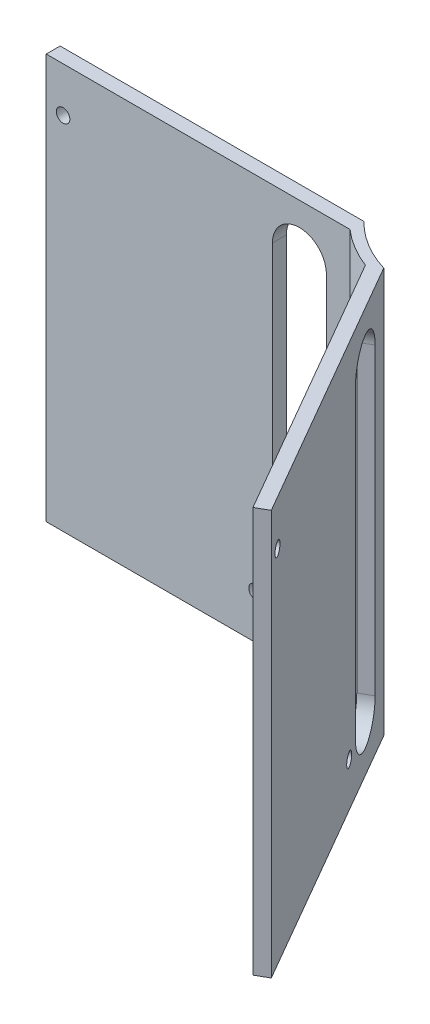
ISO-10303-21;
HEADER;
FILE_DESCRIPTION(('STEP AP214'),'2;1');
FILE_NAME('part.step','',(''),(''),'','','');
FILE_SCHEMA(('AUTOMOTIVE_DESIGN { 1 0 10303 214 1 1 1 1 }'));
ENDSEC;
DATA;
#1=APPLICATION_CONTEXT('core data for automotive mechanical design processes');
#2=APPLICATION_PROTOCOL_DEFINITION('international standard','automotive_design',2000,#1);
#3=PRODUCT_CONTEXT('',#1,'mechanical');
#4=PRODUCT('Part','Part','',(#3));
#5=PRODUCT_RELATED_PRODUCT_CATEGORY('part','',(#4));
#6=PRODUCT_DEFINITION_FORMATION('','',#4);
#7=PRODUCT_DEFINITION_CONTEXT('part definition',#1,'design');
#8=PRODUCT_DEFINITION('design','',#6,#7);
#9=PRODUCT_DEFINITION_SHAPE('','',#8);
#10=(LENGTH_UNIT() NAMED_UNIT(*) SI_UNIT(.MILLI.,.METRE.));
#11=(NAMED_UNIT(*) PLANE_ANGLE_UNIT() SI_UNIT($,.RADIAN.));
#12=(NAMED_UNIT(*) SI_UNIT($,.STERADIAN.) SOLID_ANGLE_UNIT());
#13=UNCERTAINTY_MEASURE_WITH_UNIT(LENGTH_MEASURE(1.E-05),#10,'distance_accuracy_value','');
#14=(GEOMETRIC_REPRESENTATION_CONTEXT(3) GLOBAL_UNCERTAINTY_ASSIGNED_CONTEXT((#13)) GLOBAL_UNIT_ASSIGNED_CONTEXT((#10,
#11,#12)) REPRESENTATION_CONTEXT('',''));
#15=CARTESIAN_POINT('',(0.,0.,0.));
#16=DIRECTION('',(0.,0.,1.));
#17=DIRECTION('',(1.,0.,0.));
#18=AXIS2_PLACEMENT_3D('',#15,#16,#17);
#19=CARTESIAN_POINT('',(0.,120.,28.6181760425084));
#20=DIRECTION('',(0.,0.,1.));
#21=DIRECTION('',(1.,0.,0.));
#22=AXIS2_PLACEMENT_3D('',#19,#20,#21);
#23=PLANE('',#22);
#24=CARTESIAN_POINT('',(-52.9999999999999,13.,28.6181760425084));
#25=DIRECTION('',(0.,0.,1.));
#26=DIRECTION('',(1.,0.,0.));
#27=AXIS2_PLACEMENT_3D('',#24,#25,#26);
#28=CIRCLE('',#27,2.);
#29=CARTESIAN_POINT('',(-50.9999999999999,13.,28.6181760425084));
#30=VERTEX_POINT('',#29);
#31=EDGE_CURVE('E291',#30,#30,#28,.T.);
#32=ORIENTED_EDGE('',*,*,#31,.F.);
#33=EDGE_LOOP('',(#32));
#34=FACE_BOUND('',#33,.T.);
#35=CARTESIAN_POINT('',(-110.,106.75,28.6181760425084));
#36=DIRECTION('',(0.,0.,1.));
#37=DIRECTION('',(1.,0.,0.));
#38=AXIS2_PLACEMENT_3D('',#35,#36,#37);
#39=CIRCLE('',#38,2.);
#40=CARTESIAN_POINT('',(-108.,106.75,28.6181760425084));
#41=VERTEX_POINT('',#40);
#42=EDGE_CURVE('E278',#41,#41,#39,.T.);
#43=ORIENTED_EDGE('',*,*,#42,.F.);
#44=EDGE_LOOP('',(#43));
#45=FACE_BOUND('',#44,.T.);
#46=CARTESIAN_POINT('',(-40.,105.,28.6181760425084));
#47=DIRECTION('',(0.,0.,1.));
#48=DIRECTION('',(-1.,0.,0.));
#49=AXIS2_PLACEMENT_3D('',#46,#47,#48);
#50=CIRCLE('',#49,8.);
#51=CARTESIAN_POINT('',(-32.,105.,28.6181760425084));
#52=VERTEX_POINT('',#51);
#53=CARTESIAN_POINT('',(-48.,105.,28.6181760425084));
#54=VERTEX_POINT('',#53);
#55=EDGE_CURVE('E179',#52,#54,#50,.T.);
#56=ORIENTED_EDGE('',*,*,#55,.F.);
#57=DIRECTION('',(0.,1.,0.));
#58=VECTOR('',#57,1.);
#59=CARTESIAN_POINT('',(-32.,105.,28.6181760425084));
#60=LINE('',#59,#58);
#61=CARTESIAN_POINT('',(-32.,15.,28.6181760425084));
#62=VERTEX_POINT('',#61);
#63=EDGE_CURVE('E186',#62,#52,#60,.T.);
#64=ORIENTED_EDGE('',*,*,#63,.F.);
#65=CARTESIAN_POINT('',(-40.,15.,28.6181760425084));
#66=DIRECTION('',(0.,0.,1.));
#67=DIRECTION('',(1.,0.,0.));
#68=AXIS2_PLACEMENT_3D('',#65,#66,#67);
#69=CIRCLE('',#68,8.00000000000001);
#70=CARTESIAN_POINT('',(-48.,15.,28.6181760425084));
#71=VERTEX_POINT('',#70);
#72=EDGE_CURVE('E200',#71,#62,#69,.T.);
#73=ORIENTED_EDGE('',*,*,#72,.F.);
#74=DIRECTION('',(0.,-1.,0.));
#75=VECTOR('',#74,1.);
#76=CARTESIAN_POINT('',(-48.,105.,28.6181760425084));
#77=LINE('',#76,#75);
#78=EDGE_CURVE('E197',#54,#71,#77,.T.);
#79=ORIENTED_EDGE('',*,*,#78,.F.);
#80=EDGE_LOOP('',(#56,#64,#73,#79));
#81=FACE_BOUND('',#80,.T.);
#82=DIRECTION('',(-1.,0.,0.));
#83=VECTOR('',#82,1.);
#84=CARTESIAN_POINT('',(0.,0.,28.6181760425084));
#85=LINE('',#84,#83);
#86=CARTESIAN_POINT('',(-25.,0.,28.6181760425084));
#87=VERTEX_POINT('',#86);
#88=CARTESIAN_POINT('',(-115.,0.,28.6181760425084));
#89=VERTEX_POINT('',#88);
#90=EDGE_CURVE('E207',#87,#89,#85,.T.);
#91=ORIENTED_EDGE('',*,*,#90,.F.);
#92=DIRECTION('',(0.,-1.,0.));
#93=VECTOR('',#92,1.);
#94=CARTESIAN_POINT('',(-25.,120.,28.6181760425084));
#95=LINE('',#94,#93);
#96=CARTESIAN_POINT('',(-25.,120.,28.6181760425084));
#97=VERTEX_POINT('',#96);
#98=EDGE_CURVE('E271',#97,#87,#95,.T.);
#99=ORIENTED_EDGE('',*,*,#98,.F.);
#100=DIRECTION('',(-1.,0.,0.));
#101=VECTOR('',#100,1.);
#102=CARTESIAN_POINT('',(0.,120.,28.6181760425084));
#103=LINE('',#102,#101);
#104=CARTESIAN_POINT('',(-115.,120.,28.6181760425084));
#105=VERTEX_POINT('',#104);
#106=EDGE_CURVE('E214',#97,#105,#103,.T.);
#107=ORIENTED_EDGE('',*,*,#106,.T.);
#108=DIRECTION('',(0.,-1.,0.));
#109=VECTOR('',#108,1.);
#110=CARTESIAN_POINT('',(-115.,120.,28.6181760425084));
#111=LINE('',#110,#109);
#112=EDGE_CURVE('E235',#105,#89,#111,.T.);
#113=ORIENTED_EDGE('',*,*,#112,.T.);
#114=EDGE_LOOP('',(#91,#99,#107,#113));
#115=FACE_BOUND('',#114,.T.);
#116=ADVANCED_FACE('F40',(#34,#45,#81,#115),#23,.T.);
#117=CARTESIAN_POINT('',(0.,120.,0.));
#118=DIRECTION('',(0.,-1.,0.));
#119=DIRECTION('',(0.,0.,-1.));
#120=AXIS2_PLACEMENT_3D('',#117,#118,#119);
#121=CYLINDRICAL_SURFACE('',#120,38.);
#122=CARTESIAN_POINT('',(0.,0.,0.));
#123=DIRECTION('',(0.,1.,0.));
#124=DIRECTION('',(0.,0.,1.));
#125=AXIS2_PLACEMENT_3D('',#122,#123,#124);
#126=CIRCLE('',#125,38.);
#127=CARTESIAN_POINT('',(-13.5526310368752,0.,35.5010731102361));
#128=VERTEX_POINT('',#127);
#129=EDGE_CURVE('E238',#87,#128,#126,.T.);
#130=ORIENTED_EDGE('',*,*,#129,.T.);
#131=DIRECTION('',(0.,-1.,0.));
#132=VECTOR('',#131,1.);
#133=CARTESIAN_POINT('',(-13.5526310368752,120.,35.5010731102361));
#134=LINE('',#133,#132);
#135=CARTESIAN_POINT('',(-13.5526310368752,120.,35.5010731102361));
#136=VERTEX_POINT('',#135);
#137=EDGE_CURVE('E268',#136,#128,#134,.T.);
#138=ORIENTED_EDGE('',*,*,#137,.F.);
#139=CARTESIAN_POINT('',(0.,120.,0.));
#140=DIRECTION('',(0.,1.,0.));
#141=DIRECTION('',(0.,0.,1.));
#142=AXIS2_PLACEMENT_3D('',#139,#140,#141);
#143=CIRCLE('',#142,38.);
#144=EDGE_CURVE('E217',#97,#136,#143,.T.);
#145=ORIENTED_EDGE('',*,*,#144,.F.);
#146=ORIENTED_EDGE('',*,*,#98,.T.);
#147=EDGE_LOOP('',(#130,#138,#145,#146));
#148=FACE_BOUND('',#147,.T.);
#149=ADVANCED_FACE('F310',(#148),#121,.T.);
#150=CARTESIAN_POINT('',(-25.5368888651929,120.,14.7437296605847));
#151=DIRECTION('',(0.866025403784439,0.,-0.5));
#152=DIRECTION('',(-0.5,0.,-0.866025403784439));
#153=AXIS2_PLACEMENT_3D('',#150,#151,#152);
#154=PLANE('',#153);
#155=CARTESIAN_POINT('',(0.447368963124851,13.,59.7497844162004));
#156=DIRECTION('',(-0.866025403784439,0.,0.5));
#157=DIRECTION('',(0.5,0.,0.866025403784439));
#158=AXIS2_PLACEMENT_3D('',#155,#156,#157);
#159=CIRCLE('',#158,2.);
#160=CARTESIAN_POINT('',(1.44736896312485,13.,61.4818352237693));
#161=VERTEX_POINT('',#160);
#162=EDGE_CURVE('E548',#161,#161,#159,.T.);
#163=ORIENTED_EDGE('',*,*,#162,.F.);
#164=EDGE_LOOP('',(#163));
#165=FACE_BOUND('',#164,.T.);
#166=CARTESIAN_POINT('',(29.4631111348071,106.75,110.006524076873));
#167=DIRECTION('',(-0.866025403784439,0.,0.5));
#168=DIRECTION('',(0.5,0.,0.866025403784439));
#169=AXIS2_PLACEMENT_3D('',#166,#167,#168);
#170=CIRCLE('',#169,2.);
#171=CARTESIAN_POINT('',(30.4631111348071,106.75,111.738574884442));
#172=VERTEX_POINT('',#171);
#173=EDGE_CURVE('E279',#172,#172,#170,.T.);
#174=ORIENTED_EDGE('',*,*,#173,.F.);
#175=EDGE_LOOP('',(#174));
#176=FACE_BOUND('',#175,.T.);
#177=DIRECTION('',(0.,-1.,0.));
#178=VECTOR('',#177,1.);
#179=CARTESIAN_POINT('',(-10.0526310368752,105.,41.5632509367272));
#180=LINE('',#179,#178);
#181=CARTESIAN_POINT('',(-10.0526310368752,105.,41.5632509367272));
#182=VERTEX_POINT('',#181);
#183=CARTESIAN_POINT('',(-10.0526310368752,15.,41.5632509367272));
#184=VERTEX_POINT('',#183);
#185=EDGE_CURVE('E165',#182,#184,#180,.T.);
#186=ORIENTED_EDGE('',*,*,#185,.F.);
#187=CARTESIAN_POINT('',(-6.05263103687518,105.,48.4914541670027));
#188=DIRECTION('',(-0.866025403784439,0.,0.5));
#189=DIRECTION('',(0.5,0.,0.866025403784439));
#190=AXIS2_PLACEMENT_3D('',#187,#188,#189);
#191=CIRCLE('',#190,8.);
#192=CARTESIAN_POINT('',(-2.05263103687518,105.,55.4196573972782));
#193=VERTEX_POINT('',#192);
#194=EDGE_CURVE('E56',#193,#182,#191,.T.);
#195=ORIENTED_EDGE('',*,*,#194,.F.);
#196=DIRECTION('',(0.,1.,0.));
#197=VECTOR('',#196,1.);
#198=CARTESIAN_POINT('',(-2.05263103687518,105.,55.4196573972782));
#199=LINE('',#198,#197);
#200=CARTESIAN_POINT('',(-2.05263103687518,15.,55.4196573972782));
#201=VERTEX_POINT('',#200);
#202=EDGE_CURVE('E172',#201,#193,#199,.T.);
#203=ORIENTED_EDGE('',*,*,#202,.F.);
#204=CARTESIAN_POINT('',(-6.05263103687518,15.,48.4914541670027));
#205=DIRECTION('',(-0.866025403784439,0.,0.5));
#206=DIRECTION('',(-0.5,0.,-0.866025403784439));
#207=AXIS2_PLACEMENT_3D('',#204,#205,#206);
#208=CIRCLE('',#207,8.);
#209=EDGE_CURVE('E156',#184,#201,#208,.T.);
#210=ORIENTED_EDGE('',*,*,#209,.F.);
#211=EDGE_LOOP('',(#186,#195,#203,#210));
#212=FACE_BOUND('',#211,.T.);
#213=DIRECTION('',(0.5,0.,0.866025403784439));
#214=VECTOR('',#213,1.);
#215=CARTESIAN_POINT('',(-25.5368888651929,0.,14.7437296605847));
#216=LINE('',#215,#214);
#217=CARTESIAN_POINT('',(31.9631111348071,0.,114.336651095795));
#218=VERTEX_POINT('',#217);
#219=EDGE_CURVE('E240',#128,#218,#216,.T.);
#220=ORIENTED_EDGE('',*,*,#219,.T.);
#221=DIRECTION('',(0.,-1.,0.));
#222=VECTOR('',#221,1.);
#223=CARTESIAN_POINT('',(31.9631111348071,120.,114.336651095795));
#224=LINE('',#223,#222);
#225=CARTESIAN_POINT('',(31.9631111348071,120.,114.336651095795));
#226=VERTEX_POINT('',#225);
#227=EDGE_CURVE('E265',#226,#218,#224,.T.);
#228=ORIENTED_EDGE('',*,*,#227,.F.);
#229=DIRECTION('',(0.5,0.,0.866025403784439));
#230=VECTOR('',#229,1.);
#231=CARTESIAN_POINT('',(-25.5368888651929,120.,14.7437296605847));
#232=LINE('',#231,#230);
#233=EDGE_CURVE('E220',#136,#226,#232,.T.);
#234=ORIENTED_EDGE('',*,*,#233,.F.);
#235=ORIENTED_EDGE('',*,*,#137,.T.);
#236=EDGE_LOOP('',(#220,#228,#234,#235));
#237=FACE_BOUND('',#236,.T.);
#238=ADVANCED_FACE('F169',(#165,#176,#212,#237),#154,.F.);
#239=CARTESIAN_POINT('',(57.5000000000002,120.,99.5929214352103));
#240=DIRECTION('',(-0.500000000000002,0.,-0.866025403784438));
#241=DIRECTION('',(-0.866025403784438,0.,0.500000000000002));
#242=AXIS2_PLACEMENT_3D('',#239,#240,#241);
#243=PLANE('',#242);
#244=DIRECTION('',(0.866025403784438,0.,-0.500000000000002));
#245=VECTOR('',#244,1.);
#246=CARTESIAN_POINT('',(57.5000000000002,0.,99.5929214352103));
#247=LINE('',#246,#245);
#248=CARTESIAN_POINT('',(35.411933246361,0.,112.345472721302));
#249=VERTEX_POINT('',#248);
#250=EDGE_CURVE('E242',#218,#249,#247,.T.);
#251=ORIENTED_EDGE('',*,*,#250,.T.);
#252=DIRECTION('',(0.,-1.,0.));
#253=VECTOR('',#252,1.);
#254=CARTESIAN_POINT('',(35.411933246361,120.,112.345472721302));
#255=LINE('',#254,#253);
#256=CARTESIAN_POINT('',(35.411933246361,120.,112.345472721302));
#257=VERTEX_POINT('',#256);
#258=EDGE_CURVE('E263',#257,#249,#255,.T.);
#259=ORIENTED_EDGE('',*,*,#258,.F.);
#260=DIRECTION('',(0.866025403784438,0.,-0.500000000000002));
#261=VECTOR('',#260,1.);
#262=CARTESIAN_POINT('',(57.5000000000002,120.,99.5929214352103));
#263=LINE('',#262,#261);
#264=EDGE_CURVE('E222',#226,#257,#263,.T.);
#265=ORIENTED_EDGE('',*,*,#264,.F.);
#266=ORIENTED_EDGE('',*,*,#227,.T.);
#267=EDGE_LOOP('',(#251,#259,#265,#266));
#268=FACE_BOUND('',#267,.T.);
#269=ADVANCED_FACE('F341',(#268),#243,.F.);
#270=CARTESIAN_POINT('',(-22.0880667536391,120.,12.752551286092));
#271=DIRECTION('',(0.866025403784438,0.,-0.5));
#272=DIRECTION('',(-0.5,0.,-0.866025403784438));
#273=AXIS2_PLACEMENT_3D('',#270,#271,#272);
#274=PLANE('',#273);
#275=CARTESIAN_POINT('',(3.89619107467873,13.,57.7586060417077));
#276=DIRECTION('',(0.866025403784438,0.,-0.5));
#277=DIRECTION('',(-0.5,0.,-0.866025403784438));
#278=AXIS2_PLACEMENT_3D('',#275,#276,#277);
#279=CIRCLE('',#278,2.);
#280=CARTESIAN_POINT('',(2.89619107467873,13.,56.0265552341388));
#281=VERTEX_POINT('',#280);
#282=EDGE_CURVE('E43',#281,#281,#279,.T.);
#283=ORIENTED_EDGE('',*,*,#282,.F.);
#284=EDGE_LOOP('',(#283));
#285=FACE_BOUND('',#284,.T.);
#286=CARTESIAN_POINT('',(32.911933246361,106.75,108.01534570238));
#287=DIRECTION('',(0.866025403784438,0.,-0.5));
#288=DIRECTION('',(-0.5,0.,-0.866025403784438));
#289=AXIS2_PLACEMENT_3D('',#286,#287,#288);
#290=CIRCLE('',#289,2.);
#291=CARTESIAN_POINT('',(31.911933246361,106.75,106.283294894811));
#292=VERTEX_POINT('',#291);
#293=EDGE_CURVE('E276',#292,#292,#290,.T.);
#294=ORIENTED_EDGE('',*,*,#293,.F.);
#295=EDGE_LOOP('',(#294));
#296=FACE_BOUND('',#295,.T.);
#297=CARTESIAN_POINT('',(-2.60380892532131,105.,46.5002757925099));
#298=DIRECTION('',(0.866025403784438,0.,-0.5));
#299=DIRECTION('',(-0.5,0.,-0.866025403784438));
#300=AXIS2_PLACEMENT_3D('',#297,#298,#299);
#301=CIRCLE('',#300,8.);
#302=CARTESIAN_POINT('',(-6.60380892532132,105.,39.5720725622344));
#303=VERTEX_POINT('',#302);
#304=CARTESIAN_POINT('',(1.39619107467868,105.,53.4284790227854));
#305=VERTEX_POINT('',#304);
#306=EDGE_CURVE('E11',#303,#305,#301,.T.);
#307=ORIENTED_EDGE('',*,*,#306,.F.);
#308=DIRECTION('',(0.,1.,0.));
#309=VECTOR('',#308,1.);
#310=CARTESIAN_POINT('',(-6.60380892532132,120.,39.5720725622344));
#311=LINE('',#310,#309);
#312=CARTESIAN_POINT('',(-6.60380892532131,15.,39.5720725622344));
#313=VERTEX_POINT('',#312);
#314=EDGE_CURVE('E273',#313,#303,#311,.T.);
#315=ORIENTED_EDGE('',*,*,#314,.F.);
#316=CARTESIAN_POINT('',(-2.60380892532131,15.,46.5002757925099));
#317=DIRECTION('',(0.866025403784438,0.,-0.5));
#318=DIRECTION('',(-0.5,0.,-0.866025403784438));
#319=AXIS2_PLACEMENT_3D('',#316,#317,#318);
#320=CIRCLE('',#319,8.);
#321=CARTESIAN_POINT('',(1.39619107467869,15.,53.4284790227854));
#322=VERTEX_POINT('',#321);
#323=EDGE_CURVE('E159',#322,#313,#320,.T.);
#324=ORIENTED_EDGE('',*,*,#323,.F.);
#325=DIRECTION('',(0.,-1.,0.));
#326=VECTOR('',#325,1.);
#327=CARTESIAN_POINT('',(1.39619107467869,120.,53.4284790227854));
#328=LINE('',#327,#326);
#329=EDGE_CURVE('E48',#305,#322,#328,.T.);
#330=ORIENTED_EDGE('',*,*,#329,.F.);
#331=EDGE_LOOP('',(#307,#315,#324,#330));
#332=FACE_BOUND('',#331,.T.);
#333=DIRECTION('',(0.5,0.,0.866025403784438));
#334=VECTOR('',#333,1.);
#335=CARTESIAN_POINT('',(-22.0880667536391,0.,12.752551286092));
#336=LINE('',#335,#334);
#337=CARTESIAN_POINT('',(-10.1038089253213,0.,33.5098947357433));
#338=VERTEX_POINT('',#337);
#339=EDGE_CURVE('E245',#338,#249,#336,.T.);
#340=ORIENTED_EDGE('',*,*,#339,.F.);
#341=DIRECTION('',(0.,-1.,0.));
#342=VECTOR('',#341,1.);
#343=CARTESIAN_POINT('',(-10.1038089253213,120.,33.5098947357433));
#344=LINE('',#343,#342);
#345=CARTESIAN_POINT('',(-10.1038089253213,120.,33.5098947357433));
#346=VERTEX_POINT('',#345);
#347=EDGE_CURVE('E261',#346,#338,#344,.T.);
#348=ORIENTED_EDGE('',*,*,#347,.F.);
#349=DIRECTION('',(0.5,0.,0.866025403784438));
#350=VECTOR('',#349,1.);
#351=CARTESIAN_POINT('',(-22.0880667536391,120.,12.752551286092));
#352=LINE('',#351,#350);
#353=EDGE_CURVE('E224',#346,#257,#352,.T.);
#354=ORIENTED_EDGE('',*,*,#353,.T.);
#355=ORIENTED_EDGE('',*,*,#258,.T.);
#356=EDGE_LOOP('',(#340,#348,#354,#355));
#357=FACE_BOUND('',#356,.T.);
#358=ADVANCED_FACE('F337',(#285,#296,#332,#357),#274,.T.);
#359=CARTESIAN_POINT('',(0.,120.,0.));
#360=DIRECTION('',(0.,-1.,0.));
#361=DIRECTION('',(0.,0.,-1.));
#362=AXIS2_PLACEMENT_3D('',#359,#360,#361);
#363=CYLINDRICAL_SURFACE('',#362,35.);
#364=CARTESIAN_POINT('',(0.,0.,0.));
#365=DIRECTION('',(0.,1.,0.));
#366=DIRECTION('',(0.,0.,1.));
#367=AXIS2_PLACEMENT_3D('',#364,#365,#366);
#368=CIRCLE('',#367,35.);
#369=CARTESIAN_POINT('',(-25.,0.,24.4948974278318));
#370=VERTEX_POINT('',#369);
#371=EDGE_CURVE('E248',#370,#338,#368,.T.);
#372=ORIENTED_EDGE('',*,*,#371,.F.);
#373=DIRECTION('',(0.,-1.,0.));
#374=VECTOR('',#373,1.);
#375=CARTESIAN_POINT('',(-25.,120.,24.4948974278318));
#376=LINE('',#375,#374);
#377=CARTESIAN_POINT('',(-25.,120.,24.4948974278318));
#378=VERTEX_POINT('',#377);
#379=EDGE_CURVE('E259',#378,#370,#376,.T.);
#380=ORIENTED_EDGE('',*,*,#379,.F.);
#381=CARTESIAN_POINT('',(0.,120.,0.));
#382=DIRECTION('',(0.,1.,0.));
#383=DIRECTION('',(0.,0.,1.));
#384=AXIS2_PLACEMENT_3D('',#381,#382,#383);
#385=CIRCLE('',#384,35.);
#386=EDGE_CURVE('E227',#378,#346,#385,.T.);
#387=ORIENTED_EDGE('',*,*,#386,.T.);
#388=ORIENTED_EDGE('',*,*,#347,.T.);
#389=EDGE_LOOP('',(#372,#380,#387,#388));
#390=FACE_BOUND('',#389,.T.);
#391=ADVANCED_FACE('F332',(#390),#363,.F.);
#392=CARTESIAN_POINT('',(0.,120.,24.4948974278318));
#393=DIRECTION('',(0.,0.,1.));
#394=DIRECTION('',(1.,0.,0.));
#395=AXIS2_PLACEMENT_3D('',#392,#393,#394);
#396=PLANE('',#395);
#397=CARTESIAN_POINT('',(-52.9999999999999,13.,24.4948974278318));
#398=DIRECTION('',(0.,0.,1.));
#399=DIRECTION('',(1.,0.,0.));
#400=AXIS2_PLACEMENT_3D('',#397,#398,#399);
#401=CIRCLE('',#400,2.);
#402=CARTESIAN_POINT('',(-50.9999999999999,13.,24.4948974278318));
#403=VERTEX_POINT('',#402);
#404=EDGE_CURVE('E286',#403,#403,#401,.T.);
#405=ORIENTED_EDGE('',*,*,#404,.T.);
#406=EDGE_LOOP('',(#405));
#407=FACE_BOUND('',#406,.T.);
#408=CARTESIAN_POINT('',(-110.,106.75,24.4948974278318));
#409=DIRECTION('',(0.,0.,1.));
#410=DIRECTION('',(1.,0.,0.));
#411=AXIS2_PLACEMENT_3D('',#408,#409,#410);
#412=CIRCLE('',#411,2.);
#413=CARTESIAN_POINT('',(-108.,106.75,24.4948974278318));
#414=VERTEX_POINT('',#413);
#415=EDGE_CURVE('E283',#414,#414,#412,.T.);
#416=ORIENTED_EDGE('',*,*,#415,.T.);
#417=EDGE_LOOP('',(#416));
#418=FACE_BOUND('',#417,.T.);
#419=DIRECTION('',(0.,1.,0.));
#420=VECTOR('',#419,1.);
#421=CARTESIAN_POINT('',(-32.,105.,24.4948974278318));
#422=LINE('',#421,#420);
#423=CARTESIAN_POINT('',(-32.,15.,24.4948974278318));
#424=VERTEX_POINT('',#423);
#425=CARTESIAN_POINT('',(-32.,105.,24.4948974278318));
#426=VERTEX_POINT('',#425);
#427=EDGE_CURVE('E192',#424,#426,#422,.T.);
#428=ORIENTED_EDGE('',*,*,#427,.T.);
#429=CARTESIAN_POINT('',(-40.,105.,24.4948974278318));
#430=DIRECTION('',(0.,0.,1.));
#431=DIRECTION('',(-1.,0.,0.));
#432=AXIS2_PLACEMENT_3D('',#429,#430,#431);
#433=CIRCLE('',#432,8.);
#434=CARTESIAN_POINT('',(-48.,105.,24.4948974278318));
#435=VERTEX_POINT('',#434);
#436=EDGE_CURVE('E182',#426,#435,#433,.T.);
#437=ORIENTED_EDGE('',*,*,#436,.T.);
#438=DIRECTION('',(0.,-1.,0.));
#439=VECTOR('',#438,1.);
#440=CARTESIAN_POINT('',(-48.,105.,24.4948974278318));
#441=LINE('',#440,#439);
#442=CARTESIAN_POINT('',(-48.,15.,24.4948974278318));
#443=VERTEX_POINT('',#442);
#444=EDGE_CURVE('E185',#435,#443,#441,.T.);
#445=ORIENTED_EDGE('',*,*,#444,.T.);
#446=CARTESIAN_POINT('',(-40.,15.,24.4948974278318));
#447=DIRECTION('',(0.,0.,1.));
#448=DIRECTION('',(1.,0.,0.));
#449=AXIS2_PLACEMENT_3D('',#446,#447,#448);
#450=CIRCLE('',#449,8.00000000000001);
#451=EDGE_CURVE('E189',#443,#424,#450,.T.);
#452=ORIENTED_EDGE('',*,*,#451,.T.);
#453=EDGE_LOOP('',(#428,#437,#445,#452));
#454=FACE_BOUND('',#453,.T.);
#455=DIRECTION('',(-1.,0.,0.));
#456=VECTOR('',#455,1.);
#457=CARTESIAN_POINT('',(0.,0.,24.4948974278318));
#458=LINE('',#457,#456);
#459=CARTESIAN_POINT('',(-115.,0.,24.4948974278318));
#460=VERTEX_POINT('',#459);
#461=EDGE_CURVE('E251',#370,#460,#458,.T.);
#462=ORIENTED_EDGE('',*,*,#461,.T.);
#463=DIRECTION('',(0.,-1.,0.));
#464=VECTOR('',#463,1.);
#465=CARTESIAN_POINT('',(-115.,120.,24.4948974278318));
#466=LINE('',#465,#464);
#467=CARTESIAN_POINT('',(-115.,120.,24.4948974278318));
#468=VERTEX_POINT('',#467);
#469=EDGE_CURVE('E257',#468,#460,#466,.T.);
#470=ORIENTED_EDGE('',*,*,#469,.F.);
#471=DIRECTION('',(-1.,0.,0.));
#472=VECTOR('',#471,1.);
#473=CARTESIAN_POINT('',(0.,120.,24.4948974278318));
#474=LINE('',#473,#472);
#475=EDGE_CURVE('E230',#378,#468,#474,.T.);
#476=ORIENTED_EDGE('',*,*,#475,.F.);
#477=ORIENTED_EDGE('',*,*,#379,.T.);
#478=EDGE_LOOP('',(#462,#470,#476,#477));
#479=FACE_BOUND('',#478,.T.);
#480=ADVANCED_FACE('F298',(#407,#418,#454,#479),#396,.F.);
#481=CARTESIAN_POINT('',(-115.,120.,0.));
#482=DIRECTION('',(-1.,0.,0.));
#483=DIRECTION('',(0.,0.,1.));
#484=AXIS2_PLACEMENT_3D('',#481,#482,#483);
#485=PLANE('',#484);
#486=DIRECTION('',(0.,0.,-1.));
#487=VECTOR('',#486,1.);
#488=CARTESIAN_POINT('',(-115.,0.,0.));
#489=LINE('',#488,#487);
#490=EDGE_CURVE('E218',#89,#460,#489,.T.);
#491=ORIENTED_EDGE('',*,*,#490,.F.);
#492=ORIENTED_EDGE('',*,*,#112,.F.);
#493=DIRECTION('',(0.,0.,-1.));
#494=VECTOR('',#493,1.);
#495=CARTESIAN_POINT('',(-115.,120.,0.));
#496=LINE('',#495,#494);
#497=EDGE_CURVE('E232',#105,#468,#496,.T.);
#498=ORIENTED_EDGE('',*,*,#497,.T.);
#499=ORIENTED_EDGE('',*,*,#469,.T.);
#500=EDGE_LOOP('',(#491,#492,#498,#499));
#501=FACE_BOUND('',#500,.T.);
#502=ADVANCED_FACE('F325',(#501),#485,.T.);
#503=CARTESIAN_POINT('',(0.,120.,0.));
#504=DIRECTION('',(0.,1.,0.));
#505=DIRECTION('',(0.,0.,1.));
#506=AXIS2_PLACEMENT_3D('',#503,#504,#505);
#507=PLANE('',#506);
#508=ORIENTED_EDGE('',*,*,#106,.F.);
#509=ORIENTED_EDGE('',*,*,#144,.T.);
#510=ORIENTED_EDGE('',*,*,#233,.T.);
#511=ORIENTED_EDGE('',*,*,#264,.T.);
#512=ORIENTED_EDGE('',*,*,#353,.F.);
#513=ORIENTED_EDGE('',*,*,#386,.F.);
#514=ORIENTED_EDGE('',*,*,#475,.T.);
#515=ORIENTED_EDGE('',*,*,#497,.F.);
#516=EDGE_LOOP('',(#508,#509,#510,#511,#512,#513,#514,#515));
#517=FACE_BOUND('',#516,.T.);
#518=ADVANCED_FACE('F349',(#517),#507,.T.);
#519=CARTESIAN_POINT('',(0.,0.,0.));
#520=DIRECTION('',(0.,1.,0.));
#521=DIRECTION('',(0.,0.,1.));
#522=AXIS2_PLACEMENT_3D('',#519,#520,#521);
#523=PLANE('',#522);
#524=ORIENTED_EDGE('',*,*,#90,.T.);
#525=ORIENTED_EDGE('',*,*,#490,.T.);
#526=ORIENTED_EDGE('',*,*,#461,.F.);
#527=ORIENTED_EDGE('',*,*,#371,.T.);
#528=ORIENTED_EDGE('',*,*,#339,.T.);
#529=ORIENTED_EDGE('',*,*,#250,.F.);
#530=ORIENTED_EDGE('',*,*,#219,.F.);
#531=ORIENTED_EDGE('',*,*,#129,.F.);
#532=EDGE_LOOP('',(#524,#525,#526,#527,#528,#529,#530,#531));
#533=FACE_BOUND('',#532,.T.);
#534=ADVANCED_FACE('F321',(#533),#523,.F.);
#535=CARTESIAN_POINT('',(-40.,105.,24.4948974278318));
#536=DIRECTION('',(0.,0.,1.));
#537=DIRECTION('',(1.,0.,0.));
#538=AXIS2_PLACEMENT_3D('',#535,#536,#537);
#539=CYLINDRICAL_SURFACE('',#538,8.);
#540=ORIENTED_EDGE('',*,*,#55,.T.);
#541=DIRECTION('',(0.,0.,1.));
#542=VECTOR('',#541,1.);
#543=CARTESIAN_POINT('',(-48.,105.,24.4948974278318));
#544=LINE('',#543,#542);
#545=EDGE_CURVE('E195',#435,#54,#544,.T.);
#546=ORIENTED_EDGE('',*,*,#545,.F.);
#547=ORIENTED_EDGE('',*,*,#436,.F.);
#548=DIRECTION('',(0.,0.,1.));
#549=VECTOR('',#548,1.);
#550=CARTESIAN_POINT('',(-32.,105.,24.4948974278318));
#551=LINE('',#550,#549);
#552=EDGE_CURVE('E205',#426,#52,#551,.T.);
#553=ORIENTED_EDGE('',*,*,#552,.T.);
#554=EDGE_LOOP('',(#540,#546,#547,#553));
#555=FACE_BOUND('',#554,.T.);
#556=ADVANCED_FACE('F356',(#555),#539,.F.);
#557=CARTESIAN_POINT('',(-32.,105.,24.4948974278318));
#558=DIRECTION('',(1.,0.,0.));
#559=DIRECTION('',(0.,1.,0.));
#560=AXIS2_PLACEMENT_3D('',#557,#558,#559);
#561=PLANE('',#560);
#562=ORIENTED_EDGE('',*,*,#63,.T.);
#563=ORIENTED_EDGE('',*,*,#552,.F.);
#564=ORIENTED_EDGE('',*,*,#427,.F.);
#565=DIRECTION('',(0.,0.,1.));
#566=VECTOR('',#565,1.);
#567=CARTESIAN_POINT('',(-32.,15.,24.4948974278318));
#568=LINE('',#567,#566);
#569=EDGE_CURVE('E208',#424,#62,#568,.T.);
#570=ORIENTED_EDGE('',*,*,#569,.T.);
#571=EDGE_LOOP('',(#562,#563,#564,#570));
#572=FACE_BOUND('',#571,.T.);
#573=ADVANCED_FACE('F428',(#572),#561,.F.);
#574=CARTESIAN_POINT('',(-40.,15.,24.4948974278318));
#575=DIRECTION('',(0.,0.,1.));
#576=DIRECTION('',(1.,0.,0.));
#577=AXIS2_PLACEMENT_3D('',#574,#575,#576);
#578=CYLINDRICAL_SURFACE('',#577,8.00000000000001);
#579=ORIENTED_EDGE('',*,*,#72,.T.);
#580=ORIENTED_EDGE('',*,*,#569,.F.);
#581=ORIENTED_EDGE('',*,*,#451,.F.);
#582=DIRECTION('',(0.,0.,1.));
#583=VECTOR('',#582,1.);
#584=CARTESIAN_POINT('',(-48.,15.,24.4948974278318));
#585=LINE('',#584,#583);
#586=EDGE_CURVE('E210',#443,#71,#585,.T.);
#587=ORIENTED_EDGE('',*,*,#586,.T.);
#588=EDGE_LOOP('',(#579,#580,#581,#587));
#589=FACE_BOUND('',#588,.T.);
#590=ADVANCED_FACE('F437',(#589),#578,.F.);
#591=CARTESIAN_POINT('',(-48.,105.,24.4948974278318));
#592=DIRECTION('',(-1.,0.,0.));
#593=DIRECTION('',(0.,-1.,0.));
#594=AXIS2_PLACEMENT_3D('',#591,#592,#593);
#595=PLANE('',#594);
#596=ORIENTED_EDGE('',*,*,#78,.T.);
#597=ORIENTED_EDGE('',*,*,#586,.F.);
#598=ORIENTED_EDGE('',*,*,#444,.F.);
#599=ORIENTED_EDGE('',*,*,#545,.T.);
#600=EDGE_LOOP('',(#596,#597,#598,#599));
#601=FACE_BOUND('',#600,.T.);
#602=ADVANCED_FACE('F447',(#601),#595,.F.);
#603=CARTESIAN_POINT('',(35.4366060452903,105.,24.5376319691423));
#604=DIRECTION('',(-0.866025403784439,0.,0.5));
#605=DIRECTION('',(0.5,0.,0.866025403784439));
#606=AXIS2_PLACEMENT_3D('',#603,#604,#605);
#607=CYLINDRICAL_SURFACE('',#606,8.);
#608=ORIENTED_EDGE('',*,*,#306,.T.);
#609=DIRECTION('',(-0.866025403784439,0.,0.5));
#610=VECTOR('',#609,1.);
#611=CARTESIAN_POINT('',(39.4366060452903,105.,31.4658351994178));
#612=LINE('',#611,#610);
#613=EDGE_CURVE('E177',#305,#193,#612,.T.);
#614=ORIENTED_EDGE('',*,*,#613,.T.);
#615=ORIENTED_EDGE('',*,*,#194,.T.);
#616=DIRECTION('',(-0.866025403784439,0.,0.5));
#617=VECTOR('',#616,1.);
#618=CARTESIAN_POINT('',(31.4366060452903,105.,17.6094287388667));
#619=LINE('',#618,#617);
#620=EDGE_CURVE('E162',#303,#182,#619,.T.);
#621=ORIENTED_EDGE('',*,*,#620,.F.);
#622=EDGE_LOOP('',(#608,#614,#615,#621));
#623=FACE_BOUND('',#622,.T.);
#624=ADVANCED_FACE('F457',(#623),#607,.F.);
#625=CARTESIAN_POINT('',(39.4366060452903,105.,31.4658351994178));
#626=DIRECTION('',(0.5,0.,0.866025403784439));
#627=DIRECTION('',(0.866025403784439,0.,-0.5));
#628=AXIS2_PLACEMENT_3D('',#625,#626,#627);
#629=PLANE('',#628);
#630=ORIENTED_EDGE('',*,*,#329,.T.);
#631=DIRECTION('',(-0.866025403784439,0.,0.5));
#632=VECTOR('',#631,1.);
#633=CARTESIAN_POINT('',(39.4366060452903,15.,31.4658351994178));
#634=LINE('',#633,#632);
#635=EDGE_CURVE('E161',#322,#201,#634,.T.);
#636=ORIENTED_EDGE('',*,*,#635,.T.);
#637=ORIENTED_EDGE('',*,*,#202,.T.);
#638=ORIENTED_EDGE('',*,*,#613,.F.);
#639=EDGE_LOOP('',(#630,#636,#637,#638));
#640=FACE_BOUND('',#639,.T.);
#641=ADVANCED_FACE('F466',(#640),#629,.F.);
#642=CARTESIAN_POINT('',(35.4366060452903,15.,24.5376319691423));
#643=DIRECTION('',(-0.866025403784439,0.,0.5));
#644=DIRECTION('',(0.5,0.,0.866025403784439));
#645=AXIS2_PLACEMENT_3D('',#642,#643,#644);
#646=CYLINDRICAL_SURFACE('',#645,8.);
#647=ORIENTED_EDGE('',*,*,#323,.T.);
#648=DIRECTION('',(-0.866025403784439,0.,0.5));
#649=VECTOR('',#648,1.);
#650=CARTESIAN_POINT('',(31.4366060452903,15.,17.6094287388668));
#651=LINE('',#650,#649);
#652=EDGE_CURVE('E64',#313,#184,#651,.T.);
#653=ORIENTED_EDGE('',*,*,#652,.T.);
#654=ORIENTED_EDGE('',*,*,#209,.T.);
#655=ORIENTED_EDGE('',*,*,#635,.F.);
#656=EDGE_LOOP('',(#647,#653,#654,#655));
#657=FACE_BOUND('',#656,.T.);
#658=ADVANCED_FACE('F153',(#657),#646,.F.);
#659=CARTESIAN_POINT('',(31.4366060452903,105.,17.6094287388667));
#660=DIRECTION('',(-0.5,0.,-0.866025403784439));
#661=DIRECTION('',(-0.866025403784439,0.,0.5));
#662=AXIS2_PLACEMENT_3D('',#659,#660,#661);
#663=PLANE('',#662);
#664=ORIENTED_EDGE('',*,*,#314,.T.);
#665=ORIENTED_EDGE('',*,*,#620,.T.);
#666=ORIENTED_EDGE('',*,*,#185,.T.);
#667=ORIENTED_EDGE('',*,*,#652,.F.);
#668=EDGE_LOOP('',(#664,#665,#666,#667));
#669=FACE_BOUND('',#668,.T.);
#670=ADVANCED_FACE('F166',(#669),#663,.F.);
#671=CARTESIAN_POINT('',(-110.,106.75,24.4948974278318));
#672=DIRECTION('',(0.,0.,1.));
#673=DIRECTION('',(1.,0.,0.));
#674=AXIS2_PLACEMENT_3D('',#671,#672,#673);
#675=CYLINDRICAL_SURFACE('',#674,2.);
#676=ORIENTED_EDGE('',*,*,#415,.F.);
#677=EDGE_LOOP('',(#676));
#678=FACE_BOUND('',#677,.T.);
#679=ORIENTED_EDGE('',*,*,#42,.T.);
#680=EDGE_LOOP('',(#679));
#681=FACE_BOUND('',#680,.T.);
#682=ADVANCED_FACE('F301',(#678,#681),#675,.F.);
#683=CARTESIAN_POINT('',(70.9523482169726,106.75,86.0527018790126));
#684=DIRECTION('',(-0.866025403784439,0.,0.5));
#685=DIRECTION('',(0.5,0.,0.866025403784439));
#686=AXIS2_PLACEMENT_3D('',#683,#684,#685);
#687=CYLINDRICAL_SURFACE('',#686,2.);
#688=ORIENTED_EDGE('',*,*,#293,.T.);
#689=EDGE_LOOP('',(#688));
#690=FACE_BOUND('',#689,.T.);
#691=ORIENTED_EDGE('',*,*,#173,.T.);
#692=EDGE_LOOP('',(#691));
#693=FACE_BOUND('',#692,.T.);
#694=ADVANCED_FACE('F304',(#690,#693),#687,.F.);
#695=CARTESIAN_POINT('',(-52.9999999999999,13.,24.4948974278318));
#696=DIRECTION('',(0.,0.,1.));
#697=DIRECTION('',(1.,0.,0.));
#698=AXIS2_PLACEMENT_3D('',#695,#696,#697);
#699=CYLINDRICAL_SURFACE('',#698,2.);
#700=ORIENTED_EDGE('',*,*,#404,.F.);
#701=EDGE_LOOP('',(#700));
#702=FACE_BOUND('',#701,.T.);
#703=ORIENTED_EDGE('',*,*,#31,.T.);
#704=EDGE_LOOP('',(#703));
#705=FACE_BOUND('',#704,.T.);
#706=ADVANCED_FACE('F505',(#702,#705),#699,.F.);
#707=CARTESIAN_POINT('',(41.9366060452903,13.,35.79596221834));
#708=DIRECTION('',(-0.866025403784439,0.,0.5));
#709=DIRECTION('',(0.5,0.,0.866025403784439));
#710=AXIS2_PLACEMENT_3D('',#707,#708,#709);
#711=CYLINDRICAL_SURFACE('',#710,2.);
#712=ORIENTED_EDGE('',*,*,#282,.T.);
#713=EDGE_LOOP('',(#712));
#714=FACE_BOUND('',#713,.T.);
#715=ORIENTED_EDGE('',*,*,#162,.T.);
#716=EDGE_LOOP('',(#715));
#717=FACE_BOUND('',#716,.T.);
#718=ADVANCED_FACE('F530',(#714,#717),#711,.F.);
#719=CLOSED_SHELL('',(#116,#149,#238,#269,#358,#391,#480,#502,#518,#534,#556,#573,#590,#602,
#624,#641,#658,#670,#682,#694,#706,#718));
#720=MANIFOLD_SOLID_BREP('B2',#719);
#721=ADVANCED_BREP_SHAPE_REPRESENTATION('',(#18,#720),#14);
#722=SHAPE_DEFINITION_REPRESENTATION(#9,#721);
ENDSEC;
END-ISO-10303-21;
